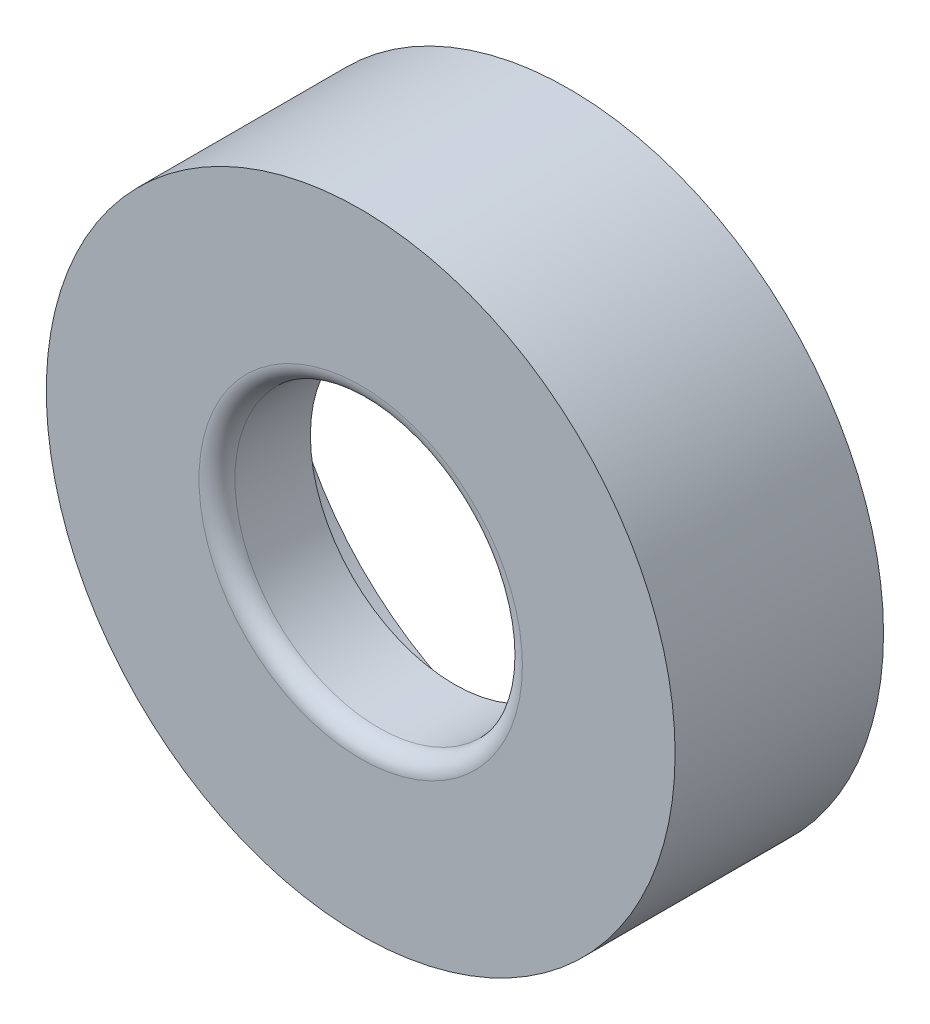
ISO-10303-21;
HEADER;
FILE_DESCRIPTION(('STEP AP214'),'2;1');
FILE_NAME('part.step','',(''),(''),'','','');
FILE_SCHEMA(('AUTOMOTIVE_DESIGN { 1 0 10303 214 1 1 1 1 }'));
ENDSEC;
DATA;
#1=APPLICATION_CONTEXT('core data for automotive mechanical design processes');
#2=APPLICATION_PROTOCOL_DEFINITION('international standard','automotive_design',2000,#1);
#3=PRODUCT_CONTEXT('',#1,'mechanical');
#4=PRODUCT('Part','Part','',(#3));
#5=PRODUCT_RELATED_PRODUCT_CATEGORY('part','',(#4));
#6=PRODUCT_DEFINITION_FORMATION('','',#4);
#7=PRODUCT_DEFINITION_CONTEXT('part definition',#1,'design');
#8=PRODUCT_DEFINITION('design','',#6,#7);
#9=PRODUCT_DEFINITION_SHAPE('','',#8);
#10=(LENGTH_UNIT() NAMED_UNIT(*) SI_UNIT(.MILLI.,.METRE.));
#11=(NAMED_UNIT(*) PLANE_ANGLE_UNIT() SI_UNIT($,.RADIAN.));
#12=(NAMED_UNIT(*) SI_UNIT($,.STERADIAN.) SOLID_ANGLE_UNIT());
#13=UNCERTAINTY_MEASURE_WITH_UNIT(LENGTH_MEASURE(1.E-05),#10,'distance_accuracy_value','');
#14=(GEOMETRIC_REPRESENTATION_CONTEXT(3) GLOBAL_UNCERTAINTY_ASSIGNED_CONTEXT((#13)) GLOBAL_UNIT_ASSIGNED_CONTEXT((#10,
#11,#12)) REPRESENTATION_CONTEXT('',''));
#15=CARTESIAN_POINT('',(0.,0.,0.));
#16=DIRECTION('',(0.,0.,1.));
#17=DIRECTION('',(1.,0.,0.));
#18=AXIS2_PLACEMENT_3D('',#15,#16,#17);
#19=CARTESIAN_POINT('',(85.2065274133614,-1.76399781545092,0.));
#20=DIRECTION('',(0.,0.,1.));
#21=DIRECTION('',(1.,0.,0.));
#22=AXIS2_PLACEMENT_3D('',#19,#20,#21);
#23=CYLINDRICAL_SURFACE('',#22,4.00000000000001);
#24=CARTESIAN_POINT('',(85.2065274133614,-1.76399781545092,5.3));
#25=DIRECTION('',(0.,0.,1.));
#26=DIRECTION('',(1.,0.,0.));
#27=AXIS2_PLACEMENT_3D('',#24,#25,#26);
#28=CIRCLE('',#27,4.00000000000001);
#29=CARTESIAN_POINT('',(89.2065274133614,-1.76399781545092,5.3));
#30=VERTEX_POINT('',#29);
#31=EDGE_CURVE('E47',#30,#30,#28,.T.);
#32=ORIENTED_EDGE('',*,*,#31,.T.);
#33=EDGE_LOOP('',(#32));
#34=FACE_BOUND('',#33,.T.);
#35=CARTESIAN_POINT('',(85.2065274133614,-1.76399781545092,3.2));
#36=DIRECTION('',(0.,0.,-1.));
#37=DIRECTION('',(-1.,0.,0.));
#38=AXIS2_PLACEMENT_3D('',#35,#36,#37);
#39=CIRCLE('',#38,4.00000000000001);
#40=CARTESIAN_POINT('',(81.2065274133614,-1.76399781545092,3.2));
#41=VERTEX_POINT('',#40);
#42=EDGE_CURVE('E60',#41,#41,#39,.F.);
#43=ORIENTED_EDGE('',*,*,#42,.F.);
#44=EDGE_LOOP('',(#43));
#45=FACE_BOUND('',#44,.T.);
#46=ADVANCED_FACE('F39',(#34,#45),#23,.F.);
#47=CARTESIAN_POINT('',(85.2065274133614,-1.76399781545092,5.8));
#48=DIRECTION('',(0.,0.,-1.));
#49=DIRECTION('',(-1.,0.,0.));
#50=AXIS2_PLACEMENT_3D('',#47,#48,#49);
#51=CYLINDRICAL_SURFACE('',#50,8.75);
#52=CARTESIAN_POINT('',(85.2065274133614,-1.76399781545092,5.8));
#53=DIRECTION('',(0.,0.,1.));
#54=DIRECTION('',(1.,0.,0.));
#55=AXIS2_PLACEMENT_3D('',#52,#53,#54);
#56=CIRCLE('',#55,8.75);
#57=CARTESIAN_POINT('',(93.9565274133614,-1.76399781545092,5.8));
#58=VERTEX_POINT('',#57);
#59=EDGE_CURVE('E52',#58,#58,#56,.T.);
#60=ORIENTED_EDGE('',*,*,#59,.F.);
#61=EDGE_LOOP('',(#60));
#62=FACE_BOUND('',#61,.T.);
#63=CARTESIAN_POINT('',(85.2065274133614,-1.76399781545092,0.));
#64=DIRECTION('',(0.,0.,1.));
#65=DIRECTION('',(1.,0.,0.));
#66=AXIS2_PLACEMENT_3D('',#63,#64,#65);
#67=CIRCLE('',#66,8.75);
#68=CARTESIAN_POINT('',(93.9565274133614,-1.76399781545092,0.));
#69=VERTEX_POINT('',#68);
#70=EDGE_CURVE('E57',#69,#69,#67,.T.);
#71=ORIENTED_EDGE('',*,*,#70,.T.);
#72=EDGE_LOOP('',(#71));
#73=FACE_BOUND('',#72,.T.);
#74=ADVANCED_FACE('F92',(#62,#73),#51,.T.);
#75=CARTESIAN_POINT('',(85.2065274133614,-1.76399781545092,5.8));
#76=DIRECTION('',(0.,0.,1.));
#77=DIRECTION('',(1.,0.,0.));
#78=AXIS2_PLACEMENT_3D('',#75,#76,#77);
#79=PLANE('',#78);
#80=CARTESIAN_POINT('',(85.2065274133614,-1.76399781545092,5.8));
#81=DIRECTION('',(0.,0.,1.));
#82=DIRECTION('',(1.,0.,0.));
#83=AXIS2_PLACEMENT_3D('',#80,#81,#82);
#84=CIRCLE('',#83,4.50000000000001);
#85=CARTESIAN_POINT('',(89.7065274133614,-1.76399781545092,5.8));
#86=VERTEX_POINT('',#85);
#87=EDGE_CURVE('E10',#86,#86,#84,.F.);
#88=ORIENTED_EDGE('',*,*,#87,.T.);
#89=EDGE_LOOP('',(#88));
#90=FACE_BOUND('',#89,.T.);
#91=ORIENTED_EDGE('',*,*,#59,.T.);
#92=EDGE_LOOP('',(#91));
#93=FACE_BOUND('',#92,.T.);
#94=ADVANCED_FACE('F88',(#90,#93),#79,.T.);
#95=CARTESIAN_POINT('',(85.2065274133614,-1.76399781545092,0.));
#96=DIRECTION('',(0.,0.,1.));
#97=DIRECTION('',(1.,0.,0.));
#98=AXIS2_PLACEMENT_3D('',#95,#96,#97);
#99=PLANE('',#98);
#100=CARTESIAN_POINT('',(85.2065274133614,-1.76399781545092,0.));
#101=DIRECTION('',(0.,0.,-1.));
#102=DIRECTION('',(-1.,0.,0.));
#103=AXIS2_PLACEMENT_3D('',#100,#101,#102);
#104=CIRCLE('',#103,8.09999999999999);
#105=CARTESIAN_POINT('',(77.1065274133614,-1.76399781545092,0.));
#106=VERTEX_POINT('',#105);
#107=EDGE_CURVE('E68',#106,#106,#104,.T.);
#108=ORIENTED_EDGE('',*,*,#107,.F.);
#109=EDGE_LOOP('',(#108));
#110=FACE_BOUND('',#109,.T.);
#111=ORIENTED_EDGE('',*,*,#70,.F.);
#112=EDGE_LOOP('',(#111));
#113=FACE_BOUND('',#112,.T.);
#114=ADVANCED_FACE('F85',(#110,#113),#99,.F.);
#115=CARTESIAN_POINT('',(85.2065274133614,-1.76399781545092,3.2));
#116=DIRECTION('',(0.,0.,-1.));
#117=DIRECTION('',(-1.,0.,0.));
#118=AXIS2_PLACEMENT_3D('',#115,#116,#117);
#119=PLANE('',#118);
#120=CARTESIAN_POINT('',(85.2065274133614,-1.76399781545092,3.2));
#121=DIRECTION('',(0.,0.,-1.));
#122=DIRECTION('',(-1.,0.,0.));
#123=AXIS2_PLACEMENT_3D('',#120,#121,#122);
#124=CIRCLE('',#123,8.09999999999999);
#125=CARTESIAN_POINT('',(77.1065274133614,-1.76399781545092,3.2));
#126=VERTEX_POINT('',#125);
#127=EDGE_CURVE('E64',#126,#126,#124,.T.);
#128=ORIENTED_EDGE('',*,*,#127,.T.);
#129=EDGE_LOOP('',(#128));
#130=FACE_BOUND('',#129,.T.);
#131=ORIENTED_EDGE('',*,*,#42,.T.);
#132=EDGE_LOOP('',(#131));
#133=FACE_BOUND('',#132,.T.);
#134=ADVANCED_FACE('F76',(#130,#133),#119,.T.);
#135=CARTESIAN_POINT('',(85.2065274133614,-1.76399781545092,3.2));
#136=DIRECTION('',(0.,0.,-1.));
#137=DIRECTION('',(-1.,0.,0.));
#138=AXIS2_PLACEMENT_3D('',#135,#136,#137);
#139=CYLINDRICAL_SURFACE('',#138,8.09999999999999);
#140=ORIENTED_EDGE('',*,*,#127,.F.);
#141=EDGE_LOOP('',(#140));
#142=FACE_BOUND('',#141,.T.);
#143=ORIENTED_EDGE('',*,*,#107,.T.);
#144=EDGE_LOOP('',(#143));
#145=FACE_BOUND('',#144,.T.);
#146=ADVANCED_FACE('F79',(#142,#145),#139,.F.);
#147=CARTESIAN_POINT('',(85.2065274133614,-1.76399781545092,5.3));
#148=DIRECTION('',(0.,0.,1.));
#149=DIRECTION('',(1.,0.,0.));
#150=AXIS2_PLACEMENT_3D('',#147,#148,#149);
#151=TOROIDAL_SURFACE('',#150,4.50000000000001,0.5);
#152=ORIENTED_EDGE('',*,*,#87,.F.);
#153=EDGE_LOOP('',(#152));
#154=FACE_BOUND('',#153,.T.);
#155=ORIENTED_EDGE('',*,*,#31,.F.);
#156=EDGE_LOOP('',(#155));
#157=FACE_BOUND('',#156,.T.);
#158=ADVANCED_FACE('F41',(#154,#157),#151,.T.);
#159=CLOSED_SHELL('',(#46,#74,#94,#114,#134,#146,#158));
#160=MANIFOLD_SOLID_BREP('B2',#159);
#161=ADVANCED_BREP_SHAPE_REPRESENTATION('',(#18,#160),#14);
#162=SHAPE_DEFINITION_REPRESENTATION(#9,#161);
ENDSEC;
END-ISO-10303-21;
